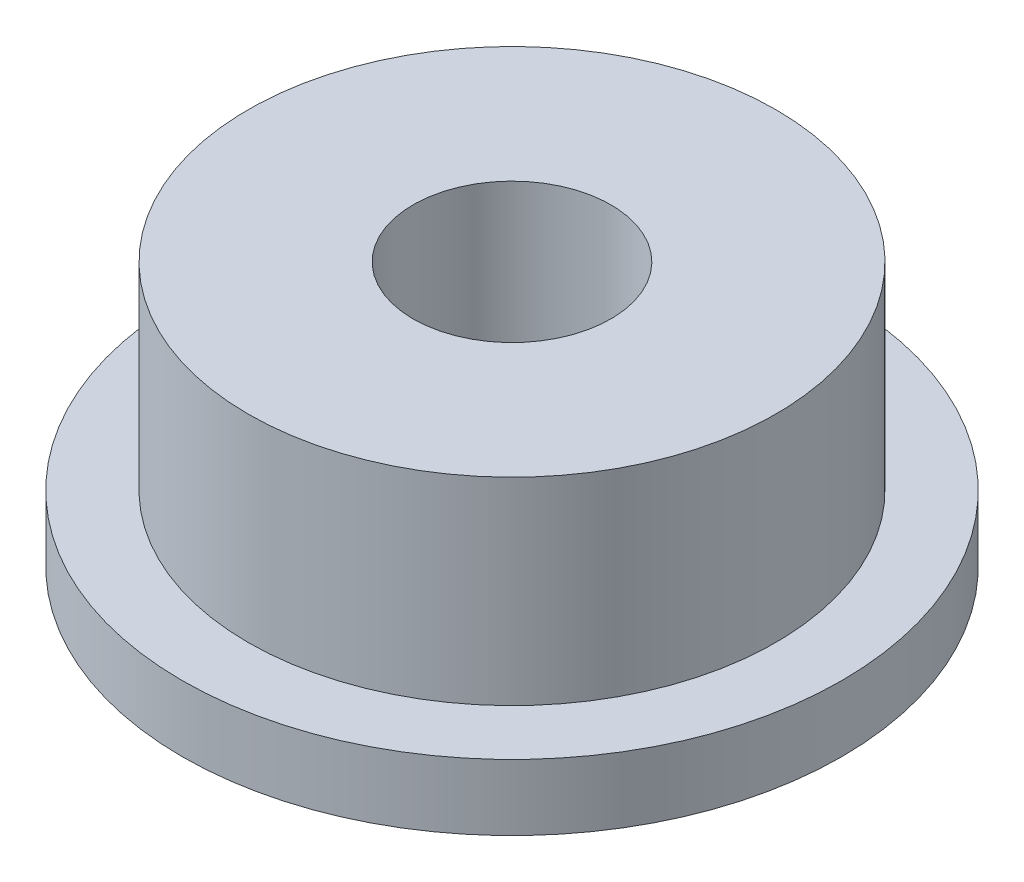
ISO-10303-21;
HEADER;
FILE_DESCRIPTION(('STEP AP214'),'2;1');
FILE_NAME('part.step','',(''),(''),'','','');
FILE_SCHEMA(('AUTOMOTIVE_DESIGN { 1 0 10303 214 1 1 1 1 }'));
ENDSEC;
DATA;
#1=APPLICATION_CONTEXT('core data for automotive mechanical design processes');
#2=APPLICATION_PROTOCOL_DEFINITION('international standard','automotive_design',2000,#1);
#3=PRODUCT_CONTEXT('',#1,'mechanical');
#4=PRODUCT('Part','Part','',(#3));
#5=PRODUCT_RELATED_PRODUCT_CATEGORY('part','',(#4));
#6=PRODUCT_DEFINITION_FORMATION('','',#4);
#7=PRODUCT_DEFINITION_CONTEXT('part definition',#1,'design');
#8=PRODUCT_DEFINITION('design','',#6,#7);
#9=PRODUCT_DEFINITION_SHAPE('','',#8);
#10=(LENGTH_UNIT() NAMED_UNIT(*) SI_UNIT(.MILLI.,.METRE.));
#11=(NAMED_UNIT(*) PLANE_ANGLE_UNIT() SI_UNIT($,.RADIAN.));
#12=(NAMED_UNIT(*) SI_UNIT($,.STERADIAN.) SOLID_ANGLE_UNIT());
#13=UNCERTAINTY_MEASURE_WITH_UNIT(LENGTH_MEASURE(1.E-05),#10,'distance_accuracy_value','');
#14=(GEOMETRIC_REPRESENTATION_CONTEXT(3) GLOBAL_UNCERTAINTY_ASSIGNED_CONTEXT((#13)) GLOBAL_UNIT_ASSIGNED_CONTEXT((#10,
#11,#12)) REPRESENTATION_CONTEXT('',''));
#15=CARTESIAN_POINT('',(0.,0.,0.));
#16=DIRECTION('',(0.,0.,1.));
#17=DIRECTION('',(1.,0.,0.));
#18=AXIS2_PLACEMENT_3D('',#15,#16,#17);
#19=CARTESIAN_POINT('',(0.,1.,0.));
#20=DIRECTION('',(0.,1.,0.));
#21=DIRECTION('',(0.,0.,1.));
#22=AXIS2_PLACEMENT_3D('',#19,#20,#21);
#23=PLANE('',#22);
#24=CARTESIAN_POINT('',(0.,1.,0.));
#25=DIRECTION('',(0.,1.,0.));
#26=DIRECTION('',(0.,0.,1.));
#27=AXIS2_PLACEMENT_3D('',#24,#25,#26);
#28=CIRCLE('',#27,4.);
#29=CARTESIAN_POINT('',(0.,1.,4.));
#30=VERTEX_POINT('',#29);
#31=EDGE_CURVE('E10',#30,#30,#28,.T.);
#32=ORIENTED_EDGE('',*,*,#31,.F.);
#33=EDGE_LOOP('',(#32));
#34=FACE_BOUND('',#33,.T.);
#35=CARTESIAN_POINT('',(0.,1.,0.));
#36=DIRECTION('',(0.,1.,0.));
#37=DIRECTION('',(0.,0.,1.));
#38=AXIS2_PLACEMENT_3D('',#35,#36,#37);
#39=CIRCLE('',#38,5.);
#40=CARTESIAN_POINT('',(0.,1.,5.));
#41=VERTEX_POINT('',#40);
#42=EDGE_CURVE('E42',#41,#41,#39,.T.);
#43=ORIENTED_EDGE('',*,*,#42,.T.);
#44=EDGE_LOOP('',(#43));
#45=FACE_BOUND('',#44,.T.);
#46=ADVANCED_FACE('F34',(#34,#45),#23,.T.);
#47=CARTESIAN_POINT('',(0.,0.,0.));
#48=DIRECTION('',(0.,1.,0.));
#49=DIRECTION('',(0.,0.,1.));
#50=AXIS2_PLACEMENT_3D('',#47,#48,#49);
#51=PLANE('',#50);
#52=CARTESIAN_POINT('',(0.,0.,0.));
#53=DIRECTION('',(0.,1.,0.));
#54=DIRECTION('',(0.,0.,1.));
#55=AXIS2_PLACEMENT_3D('',#52,#53,#54);
#56=CIRCLE('',#55,5.);
#57=CARTESIAN_POINT('',(0.,0.,5.));
#58=VERTEX_POINT('',#57);
#59=EDGE_CURVE('E38',#58,#58,#56,.T.);
#60=ORIENTED_EDGE('',*,*,#59,.F.);
#61=EDGE_LOOP('',(#60));
#62=FACE_BOUND('',#61,.T.);
#63=CARTESIAN_POINT('',(0.,0.,0.));
#64=DIRECTION('',(0.,1.,0.));
#65=DIRECTION('',(0.,0.,1.));
#66=AXIS2_PLACEMENT_3D('',#63,#64,#65);
#67=CIRCLE('',#66,1.5);
#68=CARTESIAN_POINT('',(0.,0.,1.5));
#69=VERTEX_POINT('',#68);
#70=EDGE_CURVE('E51',#69,#69,#67,.T.);
#71=ORIENTED_EDGE('',*,*,#70,.T.);
#72=EDGE_LOOP('',(#71));
#73=FACE_BOUND('',#72,.T.);
#74=ADVANCED_FACE('F78',(#62,#73),#51,.F.);
#75=CARTESIAN_POINT('',(0.,1.,0.));
#76=DIRECTION('',(0.,-1.,0.));
#77=DIRECTION('',(0.,0.,-1.));
#78=AXIS2_PLACEMENT_3D('',#75,#76,#77);
#79=CYLINDRICAL_SURFACE('',#78,5.);
#80=ORIENTED_EDGE('',*,*,#42,.F.);
#81=EDGE_LOOP('',(#80));
#82=FACE_BOUND('',#81,.T.);
#83=ORIENTED_EDGE('',*,*,#59,.T.);
#84=EDGE_LOOP('',(#83));
#85=FACE_BOUND('',#84,.T.);
#86=ADVANCED_FACE('F36',(#82,#85),#79,.T.);
#87=CARTESIAN_POINT('',(0.,1.,0.));
#88=DIRECTION('',(0.,-1.,0.));
#89=DIRECTION('',(0.,0.,-1.));
#90=AXIS2_PLACEMENT_3D('',#87,#88,#89);
#91=CYLINDRICAL_SURFACE('',#90,1.5);
#92=ORIENTED_EDGE('',*,*,#70,.F.);
#93=EDGE_LOOP('',(#92));
#94=FACE_BOUND('',#93,.T.);
#95=CARTESIAN_POINT('',(0.,4.,0.));
#96=DIRECTION('',(0.,1.,0.));
#97=DIRECTION('',(0.,0.,1.));
#98=AXIS2_PLACEMENT_3D('',#95,#96,#97);
#99=CIRCLE('',#98,1.5);
#100=CARTESIAN_POINT('',(0.,4.,1.5));
#101=VERTEX_POINT('',#100);
#102=EDGE_CURVE('E57',#101,#101,#99,.T.);
#103=ORIENTED_EDGE('',*,*,#102,.T.);
#104=EDGE_LOOP('',(#103));
#105=FACE_BOUND('',#104,.T.);
#106=ADVANCED_FACE('F63',(#94,#105),#91,.F.);
#107=CARTESIAN_POINT('',(0.,4.,0.));
#108=DIRECTION('',(0.,1.,0.));
#109=DIRECTION('',(0.,0.,1.));
#110=AXIS2_PLACEMENT_3D('',#107,#108,#109);
#111=PLANE('',#110);
#112=CARTESIAN_POINT('',(0.,4.,0.));
#113=DIRECTION('',(0.,1.,0.));
#114=DIRECTION('',(0.,0.,1.));
#115=AXIS2_PLACEMENT_3D('',#112,#113,#114);
#116=CIRCLE('',#115,4.);
#117=CARTESIAN_POINT('',(0.,4.,4.));
#118=VERTEX_POINT('',#117);
#119=EDGE_CURVE('E49',#118,#118,#116,.T.);
#120=ORIENTED_EDGE('',*,*,#119,.T.);
#121=EDGE_LOOP('',(#120));
#122=FACE_BOUND('',#121,.T.);
#123=ORIENTED_EDGE('',*,*,#102,.F.);
#124=EDGE_LOOP('',(#123));
#125=FACE_BOUND('',#124,.T.);
#126=ADVANCED_FACE('F65',(#122,#125),#111,.T.);
#127=CARTESIAN_POINT('',(0.,4.,0.));
#128=DIRECTION('',(0.,-1.,0.));
#129=DIRECTION('',(0.,0.,-1.));
#130=AXIS2_PLACEMENT_3D('',#127,#128,#129);
#131=CYLINDRICAL_SURFACE('',#130,4.);
#132=ORIENTED_EDGE('',*,*,#119,.F.);
#133=EDGE_LOOP('',(#132));
#134=FACE_BOUND('',#133,.T.);
#135=ORIENTED_EDGE('',*,*,#31,.T.);
#136=EDGE_LOOP('',(#135));
#137=FACE_BOUND('',#136,.T.);
#138=ADVANCED_FACE('F67',(#134,#137),#131,.T.);
#139=CLOSED_SHELL('',(#46,#74,#86,#106,#126,#138));
#140=MANIFOLD_SOLID_BREP('B2',#139);
#141=ADVANCED_BREP_SHAPE_REPRESENTATION('',(#18,#140),#14);
#142=SHAPE_DEFINITION_REPRESENTATION(#9,#141);
ENDSEC;
END-ISO-10303-21;
